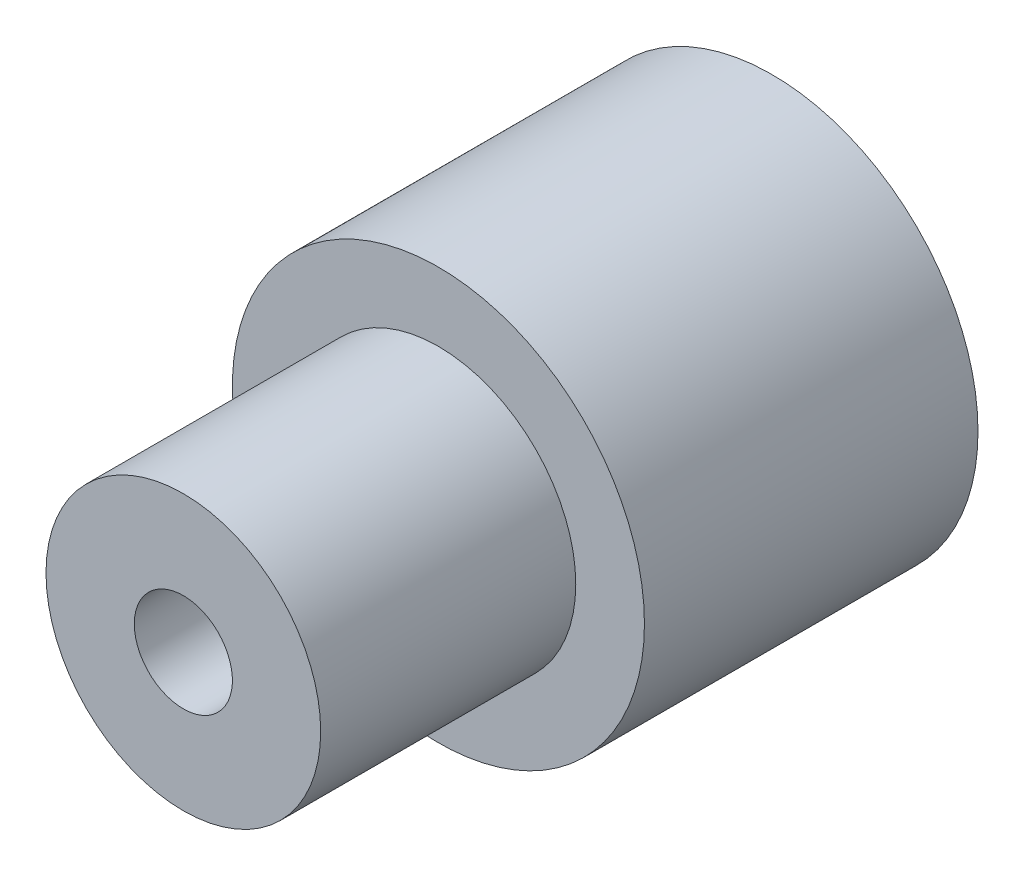
ISO-10303-21;
HEADER;
FILE_DESCRIPTION(('STEP AP214'),'2;1');
FILE_NAME('part.step','',(''),(''),'','','');
FILE_SCHEMA(('AUTOMOTIVE_DESIGN { 1 0 10303 214 1 1 1 1 }'));
ENDSEC;
DATA;
#1=APPLICATION_CONTEXT('core data for automotive mechanical design processes');
#2=APPLICATION_PROTOCOL_DEFINITION('international standard','automotive_design',2000,#1);
#3=PRODUCT_CONTEXT('',#1,'mechanical');
#4=PRODUCT('Part','Part','',(#3));
#5=PRODUCT_RELATED_PRODUCT_CATEGORY('part','',(#4));
#6=PRODUCT_DEFINITION_FORMATION('','',#4);
#7=PRODUCT_DEFINITION_CONTEXT('part definition',#1,'design');
#8=PRODUCT_DEFINITION('design','',#6,#7);
#9=PRODUCT_DEFINITION_SHAPE('','',#8);
#10=(LENGTH_UNIT() NAMED_UNIT(*) SI_UNIT(.MILLI.,.METRE.));
#11=(NAMED_UNIT(*) PLANE_ANGLE_UNIT() SI_UNIT($,.RADIAN.));
#12=(NAMED_UNIT(*) SI_UNIT($,.STERADIAN.) SOLID_ANGLE_UNIT());
#13=UNCERTAINTY_MEASURE_WITH_UNIT(LENGTH_MEASURE(1.E-05),#10,'distance_accuracy_value','');
#14=(GEOMETRIC_REPRESENTATION_CONTEXT(3) GLOBAL_UNCERTAINTY_ASSIGNED_CONTEXT((#13)) GLOBAL_UNIT_ASSIGNED_CONTEXT((#10,
#11,#12)) REPRESENTATION_CONTEXT('',''));
#15=CARTESIAN_POINT('',(0.,0.,0.));
#16=DIRECTION('',(0.,0.,1.));
#17=DIRECTION('',(1.,0.,0.));
#18=AXIS2_PLACEMENT_3D('',#15,#16,#17);
#19=CARTESIAN_POINT('',(0.,0.,17.));
#20=DIRECTION('',(0.,0.,-1.));
#21=DIRECTION('',(-1.,0.,0.));
#22=AXIS2_PLACEMENT_3D('',#19,#20,#21);
#23=CYLINDRICAL_SURFACE('',#22,10.5);
#24=CARTESIAN_POINT('',(0.,0.,17.));
#25=DIRECTION('',(0.,0.,1.));
#26=DIRECTION('',(1.,0.,0.));
#27=AXIS2_PLACEMENT_3D('',#24,#25,#26);
#28=CIRCLE('',#27,10.5);
#29=CARTESIAN_POINT('',(10.5,0.,17.));
#30=VERTEX_POINT('',#29);
#31=EDGE_CURVE('E10',#30,#30,#28,.T.);
#32=ORIENTED_EDGE('',*,*,#31,.F.);
#33=EDGE_LOOP('',(#32));
#34=FACE_BOUND('',#33,.T.);
#35=CARTESIAN_POINT('',(0.,0.,0.));
#36=DIRECTION('',(0.,0.,1.));
#37=DIRECTION('',(1.,0.,0.));
#38=AXIS2_PLACEMENT_3D('',#35,#36,#37);
#39=CIRCLE('',#38,10.5);
#40=CARTESIAN_POINT('',(10.5,0.,0.));
#41=VERTEX_POINT('',#40);
#42=EDGE_CURVE('E40',#41,#41,#39,.T.);
#43=ORIENTED_EDGE('',*,*,#42,.T.);
#44=EDGE_LOOP('',(#43));
#45=FACE_BOUND('',#44,.T.);
#46=ADVANCED_FACE('F33',(#34,#45),#23,.T.);
#47=CARTESIAN_POINT('',(0.,0.,17.));
#48=DIRECTION('',(0.,0.,1.));
#49=DIRECTION('',(1.,0.,0.));
#50=AXIS2_PLACEMENT_3D('',#47,#48,#49);
#51=PLANE('',#50);
#52=CARTESIAN_POINT('',(0.,0.,17.));
#53=DIRECTION('',(0.,0.,1.));
#54=DIRECTION('',(1.,0.,0.));
#55=AXIS2_PLACEMENT_3D('',#52,#53,#54);
#56=CIRCLE('',#55,7.);
#57=CARTESIAN_POINT('',(7.,0.,17.));
#58=VERTEX_POINT('',#57);
#59=EDGE_CURVE('E45',#58,#58,#56,.F.);
#60=ORIENTED_EDGE('',*,*,#59,.T.);
#61=EDGE_LOOP('',(#60));
#62=FACE_BOUND('',#61,.T.);
#63=ORIENTED_EDGE('',*,*,#31,.T.);
#64=EDGE_LOOP('',(#63));
#65=FACE_BOUND('',#64,.T.);
#66=ADVANCED_FACE('F72',(#62,#65),#51,.T.);
#67=CARTESIAN_POINT('',(0.,0.,0.));
#68=DIRECTION('',(0.,0.,1.));
#69=DIRECTION('',(1.,0.,0.));
#70=AXIS2_PLACEMENT_3D('',#67,#68,#69);
#71=PLANE('',#70);
#72=CARTESIAN_POINT('',(0.,0.,0.));
#73=DIRECTION('',(0.,0.,1.));
#74=DIRECTION('',(1.,0.,0.));
#75=AXIS2_PLACEMENT_3D('',#72,#73,#74);
#76=CIRCLE('',#75,2.5);
#77=CARTESIAN_POINT('',(-2.5,0.,0.));
#78=VERTEX_POINT('',#77);
#79=EDGE_CURVE('E52',#78,#78,#76,.T.);
#80=ORIENTED_EDGE('',*,*,#79,.T.);
#81=EDGE_LOOP('',(#80));
#82=FACE_BOUND('',#81,.T.);
#83=ORIENTED_EDGE('',*,*,#42,.F.);
#84=EDGE_LOOP('',(#83));
#85=FACE_BOUND('',#84,.T.);
#86=ADVANCED_FACE('F77',(#82,#85),#71,.F.);
#87=CARTESIAN_POINT('',(0.,0.,30.));
#88=DIRECTION('',(0.,0.,-1.));
#89=DIRECTION('',(-1.,0.,0.));
#90=AXIS2_PLACEMENT_3D('',#87,#88,#89);
#91=CYLINDRICAL_SURFACE('',#90,7.);
#92=ORIENTED_EDGE('',*,*,#59,.F.);
#93=EDGE_LOOP('',(#92));
#94=FACE_BOUND('',#93,.T.);
#95=CARTESIAN_POINT('',(0.,0.,30.));
#96=DIRECTION('',(0.,0.,1.));
#97=DIRECTION('',(1.,0.,0.));
#98=AXIS2_PLACEMENT_3D('',#95,#96,#97);
#99=CIRCLE('',#98,7.);
#100=CARTESIAN_POINT('',(7.,0.,30.));
#101=VERTEX_POINT('',#100);
#102=EDGE_CURVE('E49',#101,#101,#99,.T.);
#103=ORIENTED_EDGE('',*,*,#102,.F.);
#104=EDGE_LOOP('',(#103));
#105=FACE_BOUND('',#104,.T.);
#106=ADVANCED_FACE('F69',(#94,#105),#91,.T.);
#107=CARTESIAN_POINT('',(0.,0.,30.));
#108=DIRECTION('',(0.,0.,1.));
#109=DIRECTION('',(1.,0.,0.));
#110=AXIS2_PLACEMENT_3D('',#107,#108,#109);
#111=PLANE('',#110);
#112=CARTESIAN_POINT('',(0.,0.,30.));
#113=DIRECTION('',(0.,0.,1.));
#114=DIRECTION('',(1.,0.,0.));
#115=AXIS2_PLACEMENT_3D('',#112,#113,#114);
#116=CIRCLE('',#115,2.5);
#117=CARTESIAN_POINT('',(-2.5,0.,30.));
#118=VERTEX_POINT('',#117);
#119=EDGE_CURVE('E36',#118,#118,#116,.F.);
#120=ORIENTED_EDGE('',*,*,#119,.T.);
#121=EDGE_LOOP('',(#120));
#122=FACE_BOUND('',#121,.T.);
#123=ORIENTED_EDGE('',*,*,#102,.T.);
#124=EDGE_LOOP('',(#123));
#125=FACE_BOUND('',#124,.T.);
#126=ADVANCED_FACE('F59',(#122,#125),#111,.T.);
#127=CARTESIAN_POINT('',(0.,0.,58.));
#128=DIRECTION('',(0.,0.,-1.));
#129=DIRECTION('',(-1.,0.,0.));
#130=AXIS2_PLACEMENT_3D('',#127,#128,#129);
#131=CYLINDRICAL_SURFACE('',#130,2.5);
#132=CARTESIAN_POINT('',(-2.5,0.,30.));
#133=CARTESIAN_POINT('',(-2.5,0.,29.6875));
#134=CARTESIAN_POINT('',(-2.5,0.,29.375));
#135=CARTESIAN_POINT('',(-2.5,0.,28.75));
#136=CARTESIAN_POINT('',(-2.5,0.,28.4375));
#137=CARTESIAN_POINT('',(-2.5,0.,27.8125));
#138=CARTESIAN_POINT('',(-2.5,0.,27.5));
#139=CARTESIAN_POINT('',(-2.5,0.,26.875));
#140=CARTESIAN_POINT('',(-2.5,0.,26.5625));
#141=CARTESIAN_POINT('',(-2.5,0.,25.9375));
#142=CARTESIAN_POINT('',(-2.5,0.,25.625));
#143=CARTESIAN_POINT('',(-2.5,0.,25.));
#144=CARTESIAN_POINT('',(-2.5,0.,24.6875));
#145=CARTESIAN_POINT('',(-2.5,0.,24.0625));
#146=CARTESIAN_POINT('',(-2.5,0.,23.75));
#147=CARTESIAN_POINT('',(-2.5,0.,23.125));
#148=CARTESIAN_POINT('',(-2.5,0.,22.8125));
#149=CARTESIAN_POINT('',(-2.5,0.,22.1875));
#150=CARTESIAN_POINT('',(-2.5,0.,21.875));
#151=CARTESIAN_POINT('',(-2.5,0.,21.25));
#152=CARTESIAN_POINT('',(-2.5,0.,20.9375));
#153=CARTESIAN_POINT('',(-2.5,0.,20.3125));
#154=CARTESIAN_POINT('',(-2.5,0.,20.));
#155=CARTESIAN_POINT('',(-2.5,0.,19.375));
#156=CARTESIAN_POINT('',(-2.5,0.,19.0625));
#157=CARTESIAN_POINT('',(-2.5,0.,18.4375));
#158=CARTESIAN_POINT('',(-2.5,0.,18.125));
#159=CARTESIAN_POINT('',(-2.5,0.,17.5));
#160=CARTESIAN_POINT('',(-2.5,0.,17.1875));
#161=CARTESIAN_POINT('',(-2.5,0.,16.5625));
#162=CARTESIAN_POINT('',(-2.5,0.,16.25));
#163=CARTESIAN_POINT('',(-2.5,0.,15.625));
#164=CARTESIAN_POINT('',(-2.5,0.,15.3125));
#165=CARTESIAN_POINT('',(-2.5,0.,14.6875));
#166=CARTESIAN_POINT('',(-2.5,0.,14.375));
#167=CARTESIAN_POINT('',(-2.5,0.,13.75));
#168=CARTESIAN_POINT('',(-2.5,0.,13.4375));
#169=CARTESIAN_POINT('',(-2.5,0.,12.8125));
#170=CARTESIAN_POINT('',(-2.5,0.,12.5));
#171=CARTESIAN_POINT('',(-2.5,0.,11.875));
#172=CARTESIAN_POINT('',(-2.5,0.,11.5625));
#173=CARTESIAN_POINT('',(-2.5,0.,10.9375));
#174=CARTESIAN_POINT('',(-2.5,0.,10.625));
#175=CARTESIAN_POINT('',(-2.5,0.,9.99999999999999));
#176=CARTESIAN_POINT('',(-2.5,0.,9.68749999999999));
#177=CARTESIAN_POINT('',(-2.5,0.,9.06249999999999));
#178=CARTESIAN_POINT('',(-2.5,0.,8.74999999999999));
#179=CARTESIAN_POINT('',(-2.5,0.,8.12499999999999));
#180=CARTESIAN_POINT('',(-2.5,0.,7.81249999999999));
#181=CARTESIAN_POINT('',(-2.5,0.,7.18749999999999));
#182=CARTESIAN_POINT('',(-2.5,0.,6.87499999999999));
#183=CARTESIAN_POINT('',(-2.5,0.,6.24999999999999));
#184=CARTESIAN_POINT('',(-2.5,0.,5.9375));
#185=CARTESIAN_POINT('',(-2.5,0.,5.3125));
#186=CARTESIAN_POINT('',(-2.5,0.,4.99999999999999));
#187=CARTESIAN_POINT('',(-2.5,0.,4.37499999999999));
#188=CARTESIAN_POINT('',(-2.5,0.,4.06249999999999));
#189=CARTESIAN_POINT('',(-2.5,0.,3.43749999999999));
#190=CARTESIAN_POINT('',(-2.5,0.,3.12499999999999));
#191=CARTESIAN_POINT('',(-2.5,0.,2.49999999999999));
#192=CARTESIAN_POINT('',(-2.5,0.,2.18749999999999));
#193=CARTESIAN_POINT('',(-2.5,0.,1.56249999999999));
#194=CARTESIAN_POINT('',(-2.5,0.,1.24999999999999));
#195=CARTESIAN_POINT('',(-2.5,0.,0.624999999999994));
#196=CARTESIAN_POINT('',(-2.5,0.,0.312499999999993));
#197=CARTESIAN_POINT('',(-2.5,0.,0.));
#198=B_SPLINE_CURVE_WITH_KNOTS('',3,(#132,#133,#134,#135,#136,#137,#138,#139,#140,#141,#142,
#143,#144,#145,#146,#147,#148,#149,#150,#151,#152,#153,#154,#155,#156,#157,#158,#159,#160,#161,
#162,#163,#164,#165,#166,#167,#168,#169,#170,#171,#172,#173,#174,#175,#176,#177,#178,#179,#180,
#181,#182,#183,#184,#185,#186,#187,#188,#189,#190,#191,#192,#193,#194,#195,#196,#197),
.UNSPECIFIED.,.F.,.F.,(4,2,2,2,2,2,2,2,2,2,2,2,2,2,2,2,2,2,2,2,2,2,2,2,2,2,2,2,2,2,2,2,4),(0.,
0.937500000000001,1.875,2.8125,3.75,4.6875,5.62499999999999,6.5625,7.5,8.4375,9.375,10.3125,
11.25,12.1875,13.125,14.0625,15.,15.9375,16.875,17.8125,18.75,19.6875,20.625,21.5625,22.5,
23.4375,24.375,25.3125,26.25,27.1875,28.125,29.0625,30.),.UNSPECIFIED.);
#199=EDGE_CURVE('BSEAM62',#118,#78,#198,.T.);
#200=ORIENTED_EDGE('',*,*,#119,.F.);
#201=ORIENTED_EDGE('',*,*,#79,.F.);
#202=ORIENTED_EDGE('',*,*,#199,.T.);
#203=ORIENTED_EDGE('',*,*,#199,.F.);
#204=EDGE_LOOP('',(#200,#202,#201,#203));
#205=FACE_BOUND('',#204,.T.);
#206=ADVANCED_FACE('F62',(#205),#131,.F.);
#207=CLOSED_SHELL('',(#46,#66,#86,#106,#126,#206));
#208=MANIFOLD_SOLID_BREP('B2',#207);
#209=ADVANCED_BREP_SHAPE_REPRESENTATION('',(#18,#208),#14);
#210=SHAPE_DEFINITION_REPRESENTATION(#9,#209);
ENDSEC;
END-ISO-10303-21;
